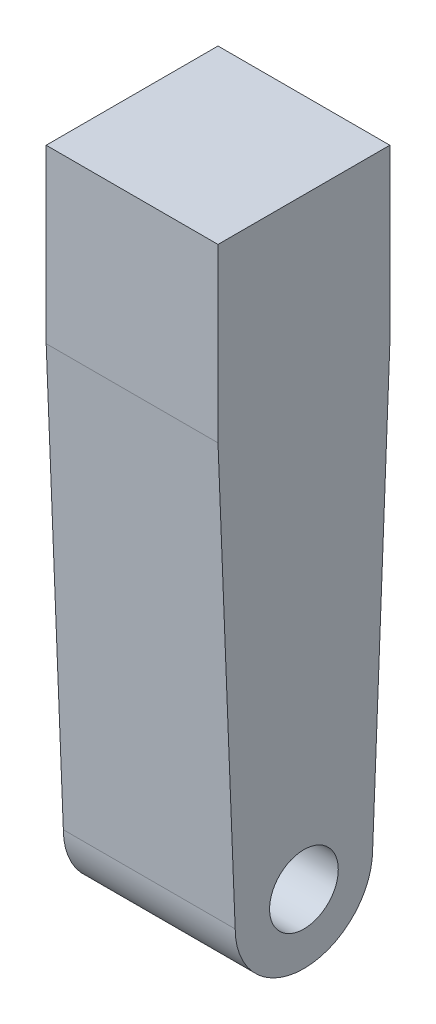
ISO-10303-21;
HEADER;
FILE_DESCRIPTION(('STEP AP214'),'2;1');
FILE_NAME('part.step','',(''),(''),'','','');
FILE_SCHEMA(('AUTOMOTIVE_DESIGN { 1 0 10303 214 1 1 1 1 }'));
ENDSEC;
DATA;
#1=APPLICATION_CONTEXT('core data for automotive mechanical design processes');
#2=APPLICATION_PROTOCOL_DEFINITION('international standard','automotive_design',2000,#1);
#3=PRODUCT_CONTEXT('',#1,'mechanical');
#4=PRODUCT('Part','Part','',(#3));
#5=PRODUCT_RELATED_PRODUCT_CATEGORY('part','',(#4));
#6=PRODUCT_DEFINITION_FORMATION('','',#4);
#7=PRODUCT_DEFINITION_CONTEXT('part definition',#1,'design');
#8=PRODUCT_DEFINITION('design','',#6,#7);
#9=PRODUCT_DEFINITION_SHAPE('','',#8);
#10=(LENGTH_UNIT() NAMED_UNIT(*) SI_UNIT(.MILLI.,.METRE.));
#11=(NAMED_UNIT(*) PLANE_ANGLE_UNIT() SI_UNIT($,.RADIAN.));
#12=(NAMED_UNIT(*) SI_UNIT($,.STERADIAN.) SOLID_ANGLE_UNIT());
#13=UNCERTAINTY_MEASURE_WITH_UNIT(LENGTH_MEASURE(1.E-05),#10,'distance_accuracy_value','');
#14=(GEOMETRIC_REPRESENTATION_CONTEXT(3) GLOBAL_UNCERTAINTY_ASSIGNED_CONTEXT((#13)) GLOBAL_UNIT_ASSIGNED_CONTEXT((#10,
#11,#12)) REPRESENTATION_CONTEXT('',''));
#15=CARTESIAN_POINT('',(0.,0.,0.));
#16=DIRECTION('',(0.,0.,1.));
#17=DIRECTION('',(1.,0.,0.));
#18=AXIS2_PLACEMENT_3D('',#15,#16,#17);
#19=CARTESIAN_POINT('',(2.5,-7.5,0.));
#20=DIRECTION('',(1.,0.,0.));
#21=DIRECTION('',(0.,0.,-1.));
#22=AXIS2_PLACEMENT_3D('',#19,#20,#21);
#23=PLANE('',#22);
#24=DIRECTION('',(0.,-0.999200958721789,-0.0399680383488718));
#25=VECTOR('',#24,1.);
#26=CARTESIAN_POINT('',(2.5,-7.5,0.999999999999999));
#27=LINE('',#26,#25);
#28=CARTESIAN_POINT('',(2.5,-1.25,1.25));
#29=VERTEX_POINT('',#28);
#30=CARTESIAN_POINT('',(2.5,-7.5,0.999999999999999));
#31=VERTEX_POINT('',#30);
#32=EDGE_CURVE('E149',#29,#31,#27,.T.);
#33=ORIENTED_EDGE('',*,*,#32,.T.);
#34=CARTESIAN_POINT('',(2.5,-7.5,0.));
#35=DIRECTION('',(1.,0.,0.));
#36=DIRECTION('',(0.,0.,-1.));
#37=AXIS2_PLACEMENT_3D('',#34,#35,#36);
#38=CIRCLE('',#37,1.);
#39=CARTESIAN_POINT('',(2.5,-7.5,-1.));
#40=VERTEX_POINT('',#39);
#41=EDGE_CURVE('E97',#31,#40,#38,.T.);
#42=ORIENTED_EDGE('',*,*,#41,.T.);
#43=DIRECTION('',(0.,0.999200958721789,-0.0399680383488714));
#44=VECTOR('',#43,1.);
#45=CARTESIAN_POINT('',(2.5,-1.25,-1.25));
#46=LINE('',#45,#44);
#47=CARTESIAN_POINT('',(2.5,-1.25,-1.25));
#48=VERTEX_POINT('',#47);
#49=EDGE_CURVE('E110',#40,#48,#46,.T.);
#50=ORIENTED_EDGE('',*,*,#49,.T.);
#51=DIRECTION('',(0.,1.,0.));
#52=VECTOR('',#51,1.);
#53=CARTESIAN_POINT('',(2.5,1.25,-1.25));
#54=LINE('',#53,#52);
#55=CARTESIAN_POINT('',(2.5,1.25,-1.25));
#56=VERTEX_POINT('',#55);
#57=EDGE_CURVE('E104',#48,#56,#54,.T.);
#58=ORIENTED_EDGE('',*,*,#57,.T.);
#59=DIRECTION('',(0.,0.,1.));
#60=VECTOR('',#59,1.);
#61=CARTESIAN_POINT('',(2.5,1.25,-1.25));
#62=LINE('',#61,#60);
#63=CARTESIAN_POINT('',(2.5,1.25,1.25));
#64=VERTEX_POINT('',#63);
#65=EDGE_CURVE('E108',#56,#64,#62,.T.);
#66=ORIENTED_EDGE('',*,*,#65,.T.);
#67=DIRECTION('',(0.,-1.,0.));
#68=VECTOR('',#67,1.);
#69=CARTESIAN_POINT('',(2.5,1.25,1.25));
#70=LINE('',#69,#68);
#71=EDGE_CURVE('E60',#64,#29,#70,.T.);
#72=ORIENTED_EDGE('',*,*,#71,.T.);
#73=EDGE_LOOP('',(#33,#42,#50,#58,#66,#72));
#74=FACE_BOUND('',#73,.T.);
#75=CARTESIAN_POINT('',(2.5,-7.5,0.));
#76=DIRECTION('',(1.,0.,0.));
#77=DIRECTION('',(0.,0.,-1.));
#78=AXIS2_PLACEMENT_3D('',#75,#76,#77);
#79=CIRCLE('',#78,0.5);
#80=CARTESIAN_POINT('',(2.5,-7.5,-0.500000000000001));
#81=VERTEX_POINT('',#80);
#82=EDGE_CURVE('E137',#81,#81,#79,.T.);
#83=ORIENTED_EDGE('',*,*,#82,.F.);
#84=EDGE_LOOP('',(#83));
#85=FACE_BOUND('',#84,.T.);
#86=ADVANCED_FACE('F42',(#74,#85),#23,.T.);
#87=CARTESIAN_POINT('',(0.,-7.5,0.));
#88=DIRECTION('',(1.,0.,0.));
#89=DIRECTION('',(0.,0.,-1.));
#90=AXIS2_PLACEMENT_3D('',#87,#88,#89);
#91=PLANE('',#90);
#92=DIRECTION('',(0.,-0.999200958721789,-0.0399680383488718));
#93=VECTOR('',#92,1.);
#94=CARTESIAN_POINT('',(0.,-7.5,0.999999999999999));
#95=LINE('',#94,#93);
#96=CARTESIAN_POINT('',(0.,-1.25,1.25));
#97=VERTEX_POINT('',#96);
#98=CARTESIAN_POINT('',(0.,-7.5,0.999999999999999));
#99=VERTEX_POINT('',#98);
#100=EDGE_CURVE('E132',#97,#99,#95,.T.);
#101=ORIENTED_EDGE('',*,*,#100,.F.);
#102=DIRECTION('',(0.,-1.,0.));
#103=VECTOR('',#102,1.);
#104=CARTESIAN_POINT('',(0.,1.25,1.25));
#105=LINE('',#104,#103);
#106=CARTESIAN_POINT('',(0.,1.25,1.25));
#107=VERTEX_POINT('',#106);
#108=EDGE_CURVE('E89',#107,#97,#105,.T.);
#109=ORIENTED_EDGE('',*,*,#108,.F.);
#110=DIRECTION('',(0.,0.,1.));
#111=VECTOR('',#110,1.);
#112=CARTESIAN_POINT('',(0.,1.25,-1.25));
#113=LINE('',#112,#111);
#114=CARTESIAN_POINT('',(0.,1.25,-1.25));
#115=VERTEX_POINT('',#114);
#116=EDGE_CURVE('E83',#115,#107,#113,.T.);
#117=ORIENTED_EDGE('',*,*,#116,.F.);
#118=DIRECTION('',(0.,1.,0.));
#119=VECTOR('',#118,1.);
#120=CARTESIAN_POINT('',(0.,1.25,-1.25));
#121=LINE('',#120,#119);
#122=CARTESIAN_POINT('',(0.,-1.25,-1.25));
#123=VERTEX_POINT('',#122);
#124=EDGE_CURVE('E119',#123,#115,#121,.T.);
#125=ORIENTED_EDGE('',*,*,#124,.F.);
#126=DIRECTION('',(0.,0.999200958721789,-0.0399680383488714));
#127=VECTOR('',#126,1.);
#128=CARTESIAN_POINT('',(0.,-1.25,-1.25));
#129=LINE('',#128,#127);
#130=CARTESIAN_POINT('',(0.,-7.5,-1.));
#131=VERTEX_POINT('',#130);
#132=EDGE_CURVE('E140',#131,#123,#129,.T.);
#133=ORIENTED_EDGE('',*,*,#132,.F.);
#134=CARTESIAN_POINT('',(0.,-7.5,0.));
#135=DIRECTION('',(1.,0.,0.));
#136=DIRECTION('',(0.,0.,-1.));
#137=AXIS2_PLACEMENT_3D('',#134,#135,#136);
#138=CIRCLE('',#137,1.);
#139=EDGE_CURVE('E136',#99,#131,#138,.T.);
#140=ORIENTED_EDGE('',*,*,#139,.F.);
#141=EDGE_LOOP('',(#101,#109,#117,#125,#133,#140));
#142=FACE_BOUND('',#141,.T.);
#143=CARTESIAN_POINT('',(0.,-7.5,0.));
#144=DIRECTION('',(1.,0.,0.));
#145=DIRECTION('',(0.,0.,-1.));
#146=AXIS2_PLACEMENT_3D('',#143,#144,#145);
#147=CIRCLE('',#146,0.5);
#148=CARTESIAN_POINT('',(0.,-7.5,-0.500000000000001));
#149=VERTEX_POINT('',#148);
#150=EDGE_CURVE('E264',#149,#149,#147,.T.);
#151=ORIENTED_EDGE('',*,*,#150,.T.);
#152=EDGE_LOOP('',(#151));
#153=FACE_BOUND('',#152,.T.);
#154=ADVANCED_FACE('F162',(#142,#153),#91,.F.);
#155=CARTESIAN_POINT('',(2.5,-7.5,0.999999999999999));
#156=DIRECTION('',(0.,0.0399680383488718,-0.99920095872179));
#157=DIRECTION('',(0.,0.999200958721789,0.0399680383488718));
#158=AXIS2_PLACEMENT_3D('',#155,#156,#157);
#159=PLANE('',#158);
#160=ORIENTED_EDGE('',*,*,#100,.T.);
#161=DIRECTION('',(-1.,0.,0.));
#162=VECTOR('',#161,1.);
#163=CARTESIAN_POINT('',(2.5,-7.5,0.999999999999999));
#164=LINE('',#163,#162);
#165=EDGE_CURVE('E11',#31,#99,#164,.T.);
#166=ORIENTED_EDGE('',*,*,#165,.F.);
#167=ORIENTED_EDGE('',*,*,#32,.F.);
#168=DIRECTION('',(-1.,0.,0.));
#169=VECTOR('',#168,1.);
#170=CARTESIAN_POINT('',(2.5,-1.25,1.25));
#171=LINE('',#170,#169);
#172=EDGE_CURVE('E128',#29,#97,#171,.T.);
#173=ORIENTED_EDGE('',*,*,#172,.T.);
#174=EDGE_LOOP('',(#160,#166,#167,#173));
#175=FACE_BOUND('',#174,.T.);
#176=ADVANCED_FACE('F44',(#175),#159,.F.);
#177=CARTESIAN_POINT('',(2.5,-7.5,0.));
#178=DIRECTION('',(-1.,0.,0.));
#179=DIRECTION('',(0.,0.,1.));
#180=AXIS2_PLACEMENT_3D('',#177,#178,#179);
#181=CYLINDRICAL_SURFACE('',#180,1.);
#182=ORIENTED_EDGE('',*,*,#139,.T.);
#183=DIRECTION('',(-1.,0.,0.));
#184=VECTOR('',#183,1.);
#185=CARTESIAN_POINT('',(2.5,-7.5,-1.));
#186=LINE('',#185,#184);
#187=EDGE_CURVE('E52',#40,#131,#186,.T.);
#188=ORIENTED_EDGE('',*,*,#187,.F.);
#189=ORIENTED_EDGE('',*,*,#41,.F.);
#190=ORIENTED_EDGE('',*,*,#165,.T.);
#191=EDGE_LOOP('',(#182,#188,#189,#190));
#192=FACE_BOUND('',#191,.T.);
#193=ADVANCED_FACE('F187',(#192),#181,.T.);
#194=CARTESIAN_POINT('',(2.5,-1.25,-1.25));
#195=DIRECTION('',(0.,0.0399680383488714,0.999200958721789));
#196=DIRECTION('',(0.,-0.99920095872179,0.0399680383488714));
#197=AXIS2_PLACEMENT_3D('',#194,#195,#196);
#198=PLANE('',#197);
#199=ORIENTED_EDGE('',*,*,#132,.T.);
#200=DIRECTION('',(-1.,0.,0.));
#201=VECTOR('',#200,1.);
#202=CARTESIAN_POINT('',(2.5,-1.25,-1.25));
#203=LINE('',#202,#201);
#204=EDGE_CURVE('E121',#48,#123,#203,.T.);
#205=ORIENTED_EDGE('',*,*,#204,.F.);
#206=ORIENTED_EDGE('',*,*,#49,.F.);
#207=ORIENTED_EDGE('',*,*,#187,.T.);
#208=EDGE_LOOP('',(#199,#205,#206,#207));
#209=FACE_BOUND('',#208,.T.);
#210=ADVANCED_FACE('F159',(#209),#198,.F.);
#211=CARTESIAN_POINT('',(2.5,1.25,-1.25));
#212=DIRECTION('',(0.,0.,1.));
#213=DIRECTION('',(0.,-1.,0.));
#214=AXIS2_PLACEMENT_3D('',#211,#212,#213);
#215=PLANE('',#214);
#216=ORIENTED_EDGE('',*,*,#124,.T.);
#217=DIRECTION('',(-1.,0.,0.));
#218=VECTOR('',#217,1.);
#219=CARTESIAN_POINT('',(2.5,1.25,-1.25));
#220=LINE('',#219,#218);
#221=EDGE_CURVE('E116',#56,#115,#220,.T.);
#222=ORIENTED_EDGE('',*,*,#221,.F.);
#223=ORIENTED_EDGE('',*,*,#57,.F.);
#224=ORIENTED_EDGE('',*,*,#204,.T.);
#225=EDGE_LOOP('',(#216,#222,#223,#224));
#226=FACE_BOUND('',#225,.T.);
#227=ADVANCED_FACE('F117',(#226),#215,.F.);
#228=CARTESIAN_POINT('',(2.5,1.25,-1.25));
#229=DIRECTION('',(0.,-1.,0.));
#230=DIRECTION('',(0.,0.,-1.));
#231=AXIS2_PLACEMENT_3D('',#228,#229,#230);
#232=PLANE('',#231);
#233=ORIENTED_EDGE('',*,*,#116,.T.);
#234=DIRECTION('',(-1.,0.,0.));
#235=VECTOR('',#234,1.);
#236=CARTESIAN_POINT('',(2.5,1.25,1.25));
#237=LINE('',#236,#235);
#238=EDGE_CURVE('E122',#64,#107,#237,.T.);
#239=ORIENTED_EDGE('',*,*,#238,.F.);
#240=ORIENTED_EDGE('',*,*,#65,.F.);
#241=ORIENTED_EDGE('',*,*,#221,.T.);
#242=EDGE_LOOP('',(#233,#239,#240,#241));
#243=FACE_BOUND('',#242,.T.);
#244=ADVANCED_FACE('F124',(#243),#232,.F.);
#245=CARTESIAN_POINT('',(2.5,1.25,1.25));
#246=DIRECTION('',(0.,0.,-1.));
#247=DIRECTION('',(0.,1.,0.));
#248=AXIS2_PLACEMENT_3D('',#245,#246,#247);
#249=PLANE('',#248);
#250=ORIENTED_EDGE('',*,*,#108,.T.);
#251=ORIENTED_EDGE('',*,*,#172,.F.);
#252=ORIENTED_EDGE('',*,*,#71,.F.);
#253=ORIENTED_EDGE('',*,*,#238,.T.);
#254=EDGE_LOOP('',(#250,#251,#252,#253));
#255=FACE_BOUND('',#254,.T.);
#256=ADVANCED_FACE('F167',(#255),#249,.F.);
#257=CARTESIAN_POINT('',(2.5,-7.5,0.));
#258=DIRECTION('',(-1.,0.,0.));
#259=DIRECTION('',(0.,0.,1.));
#260=AXIS2_PLACEMENT_3D('',#257,#258,#259);
#261=CYLINDRICAL_SURFACE('',#260,0.5);
#262=ORIENTED_EDGE('',*,*,#82,.T.);
#263=EDGE_LOOP('',(#262));
#264=FACE_BOUND('',#263,.T.);
#265=ORIENTED_EDGE('',*,*,#150,.F.);
#266=EDGE_LOOP('',(#265));
#267=FACE_BOUND('',#266,.T.);
#268=ADVANCED_FACE('F169',(#264,#267),#261,.F.);
#269=CLOSED_SHELL('',(#86,#154,#176,#193,#210,#227,#244,#256,#268));
#270=MANIFOLD_SOLID_BREP('B2',#269);
#271=ADVANCED_BREP_SHAPE_REPRESENTATION('',(#18,#270),#14);
#272=SHAPE_DEFINITION_REPRESENTATION(#9,#271);
ENDSEC;
END-ISO-10303-21;
